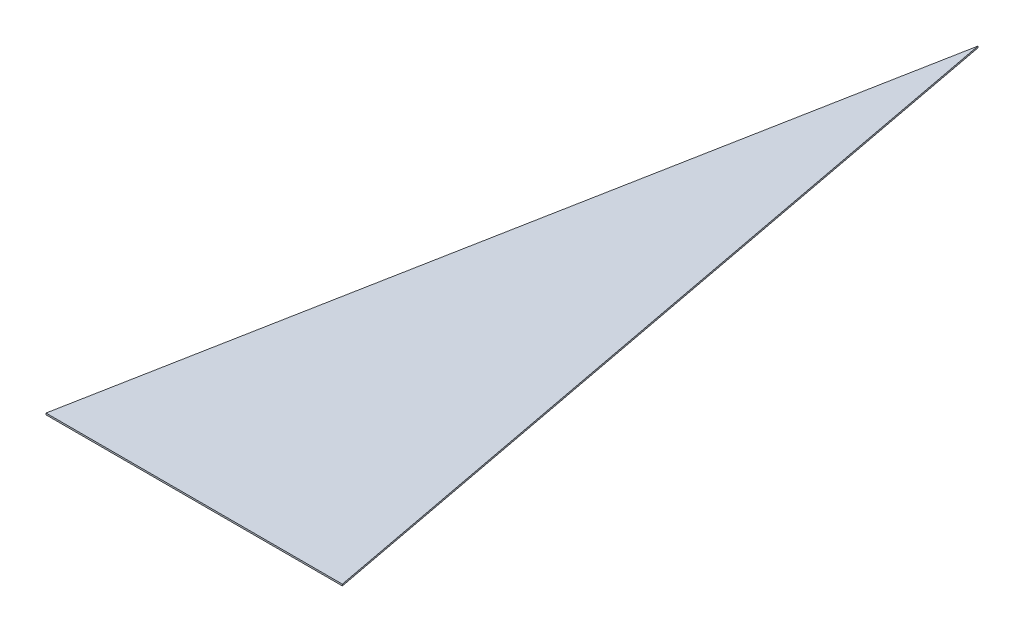
ISO-10303-21;
HEADER;
FILE_DESCRIPTION(('STEP AP214'),'2;1');
FILE_NAME('part.step','',(''),(''),'','','');
FILE_SCHEMA(('AUTOMOTIVE_DESIGN { 1 0 10303 214 1 1 1 1 }'));
ENDSEC;
DATA;
#1=APPLICATION_CONTEXT('core data for automotive mechanical design processes');
#2=APPLICATION_PROTOCOL_DEFINITION('international standard','automotive_design',2000,#1);
#3=PRODUCT_CONTEXT('',#1,'mechanical');
#4=PRODUCT('Part','Part','',(#3));
#5=PRODUCT_RELATED_PRODUCT_CATEGORY('part','',(#4));
#6=PRODUCT_DEFINITION_FORMATION('','',#4);
#7=PRODUCT_DEFINITION_CONTEXT('part definition',#1,'design');
#8=PRODUCT_DEFINITION('design','',#6,#7);
#9=PRODUCT_DEFINITION_SHAPE('','',#8);
#10=(LENGTH_UNIT() NAMED_UNIT(*) SI_UNIT(.MILLI.,.METRE.));
#11=(NAMED_UNIT(*) PLANE_ANGLE_UNIT() SI_UNIT($,.RADIAN.));
#12=(NAMED_UNIT(*) SI_UNIT($,.STERADIAN.) SOLID_ANGLE_UNIT());
#13=UNCERTAINTY_MEASURE_WITH_UNIT(LENGTH_MEASURE(1.E-05),#10,'distance_accuracy_value','');
#14=(GEOMETRIC_REPRESENTATION_CONTEXT(3) GLOBAL_UNCERTAINTY_ASSIGNED_CONTEXT((#13)) GLOBAL_UNIT_ASSIGNED_CONTEXT((#10,
#11,#12)) REPRESENTATION_CONTEXT('',''));
#15=CARTESIAN_POINT('',(0.,0.,0.));
#16=DIRECTION('',(0.,0.,1.));
#17=DIRECTION('',(1.,0.,0.));
#18=AXIS2_PLACEMENT_3D('',#15,#16,#17);
#19=CARTESIAN_POINT('',(-2813.33324341118,30.48,2689.5552));
#20=DIRECTION('',(0.982595515959988,0.,0.185758046973276));
#21=DIRECTION('',(0.185758046973276,0.,-0.982595515959988));
#22=AXIS2_PLACEMENT_3D('',#19,#20,#21);
#23=PLANE('',#22);
#24=DIRECTION('',(-0.185758046973276,0.,0.982595515959988));
#25=VECTOR('',#24,1.);
#26=CARTESIAN_POINT('',(-2813.33324341118,0.,2689.5552));
#27=LINE('',#26,#25);
#28=CARTESIAN_POINT('',(0.,0.,-12192.));
#29=VERTEX_POINT('',#28);
#30=CARTESIAN_POINT('',(-2813.33324341118,0.,2689.5552));
#31=VERTEX_POINT('',#30);
#32=EDGE_CURVE('E86',#29,#31,#27,.T.);
#33=ORIENTED_EDGE('',*,*,#32,.T.);
#34=DIRECTION('',(0.,-1.,0.));
#35=VECTOR('',#34,1.);
#36=CARTESIAN_POINT('',(-2813.33324341118,30.48,2689.5552));
#37=LINE('',#36,#35);
#38=CARTESIAN_POINT('',(-2813.33324341118,30.48,2689.5552));
#39=VERTEX_POINT('',#38);
#40=EDGE_CURVE('E11',#39,#31,#37,.T.);
#41=ORIENTED_EDGE('',*,*,#40,.F.);
#42=DIRECTION('',(-0.185758046973276,0.,0.982595515959988));
#43=VECTOR('',#42,1.);
#44=CARTESIAN_POINT('',(-2813.33324341118,30.48,2689.5552));
#45=LINE('',#44,#43);
#46=CARTESIAN_POINT('',(0.,30.48,-12192.));
#47=VERTEX_POINT('',#46);
#48=EDGE_CURVE('E79',#47,#39,#45,.T.);
#49=ORIENTED_EDGE('',*,*,#48,.F.);
#50=DIRECTION('',(0.,-1.,0.));
#51=VECTOR('',#50,1.);
#52=CARTESIAN_POINT('',(0.,30.48,-12192.));
#53=LINE('',#52,#51);
#54=EDGE_CURVE('E87',#47,#29,#53,.T.);
#55=ORIENTED_EDGE('',*,*,#54,.T.);
#56=EDGE_LOOP('',(#33,#41,#49,#55));
#57=FACE_BOUND('',#56,.T.);
#58=ADVANCED_FACE('F39',(#57),#23,.F.);
#59=CARTESIAN_POINT('',(2813.33324341118,30.48,2689.5552));
#60=DIRECTION('',(0.,0.,-1.));
#61=DIRECTION('',(-1.,0.,0.));
#62=AXIS2_PLACEMENT_3D('',#59,#60,#61);
#63=PLANE('',#62);
#64=DIRECTION('',(1.,0.,0.));
#65=VECTOR('',#64,1.);
#66=CARTESIAN_POINT('',(2813.33324341118,0.,2689.5552));
#67=LINE('',#66,#65);
#68=CARTESIAN_POINT('',(2813.33324341118,0.,2689.5552));
#69=VERTEX_POINT('',#68);
#70=EDGE_CURVE('E67',#31,#69,#67,.T.);
#71=ORIENTED_EDGE('',*,*,#70,.T.);
#72=DIRECTION('',(0.,-1.,0.));
#73=VECTOR('',#72,1.);
#74=CARTESIAN_POINT('',(2813.33324341118,30.48,2689.5552));
#75=LINE('',#74,#73);
#76=CARTESIAN_POINT('',(2813.33324341118,30.48,2689.5552));
#77=VERTEX_POINT('',#76);
#78=EDGE_CURVE('E47',#77,#69,#75,.T.);
#79=ORIENTED_EDGE('',*,*,#78,.F.);
#80=DIRECTION('',(1.,0.,0.));
#81=VECTOR('',#80,1.);
#82=CARTESIAN_POINT('',(2813.33324341118,30.48,2689.5552));
#83=LINE('',#82,#81);
#84=EDGE_CURVE('E75',#39,#77,#83,.T.);
#85=ORIENTED_EDGE('',*,*,#84,.F.);
#86=ORIENTED_EDGE('',*,*,#40,.T.);
#87=EDGE_LOOP('',(#71,#79,#85,#86));
#88=FACE_BOUND('',#87,.T.);
#89=ADVANCED_FACE('F76',(#88),#63,.F.);
#90=CARTESIAN_POINT('',(0.,30.48,-12192.));
#91=DIRECTION('',(-0.982595515959988,0.,0.185758046973276));
#92=DIRECTION('',(0.185758046973276,0.,0.982595515959988));
#93=AXIS2_PLACEMENT_3D('',#90,#91,#92);
#94=PLANE('',#93);
#95=DIRECTION('',(-0.185758046973276,0.,-0.982595515959988));
#96=VECTOR('',#95,1.);
#97=CARTESIAN_POINT('',(0.,0.,-12192.));
#98=LINE('',#97,#96);
#99=EDGE_CURVE('E72',#69,#29,#98,.T.);
#100=ORIENTED_EDGE('',*,*,#99,.T.);
#101=ORIENTED_EDGE('',*,*,#54,.F.);
#102=DIRECTION('',(-0.185758046973276,0.,-0.982595515959988));
#103=VECTOR('',#102,1.);
#104=CARTESIAN_POINT('',(0.,30.48,-12192.));
#105=LINE('',#104,#103);
#106=EDGE_CURVE('E55',#77,#47,#105,.T.);
#107=ORIENTED_EDGE('',*,*,#106,.F.);
#108=ORIENTED_EDGE('',*,*,#78,.T.);
#109=EDGE_LOOP('',(#100,#101,#107,#108));
#110=FACE_BOUND('',#109,.T.);
#111=ADVANCED_FACE('F94',(#110),#94,.F.);
#112=CARTESIAN_POINT('',(0.,30.48,0.));
#113=DIRECTION('',(0.,1.,0.));
#114=DIRECTION('',(0.,0.,1.));
#115=AXIS2_PLACEMENT_3D('',#112,#113,#114);
#116=PLANE('',#115);
#117=ORIENTED_EDGE('',*,*,#48,.T.);
#118=ORIENTED_EDGE('',*,*,#84,.T.);
#119=ORIENTED_EDGE('',*,*,#106,.T.);
#120=EDGE_LOOP('',(#117,#118,#119));
#121=FACE_BOUND('',#120,.T.);
#122=ADVANCED_FACE('F82',(#121),#116,.T.);
#123=CARTESIAN_POINT('',(0.,0.,0.));
#124=DIRECTION('',(0.,1.,0.));
#125=DIRECTION('',(0.,0.,1.));
#126=AXIS2_PLACEMENT_3D('',#123,#124,#125);
#127=PLANE('',#126);
#128=ORIENTED_EDGE('',*,*,#32,.F.);
#129=ORIENTED_EDGE('',*,*,#99,.F.);
#130=ORIENTED_EDGE('',*,*,#70,.F.);
#131=EDGE_LOOP('',(#128,#129,#130));
#132=FACE_BOUND('',#131,.T.);
#133=ADVANCED_FACE('F95',(#132),#127,.F.);
#134=CLOSED_SHELL('',(#58,#89,#111,#122,#133));
#135=MANIFOLD_SOLID_BREP('B2',#134);
#136=ADVANCED_BREP_SHAPE_REPRESENTATION('',(#18,#135),#14);
#137=SHAPE_DEFINITION_REPRESENTATION(#9,#136);
ENDSEC;
END-ISO-10303-21;
